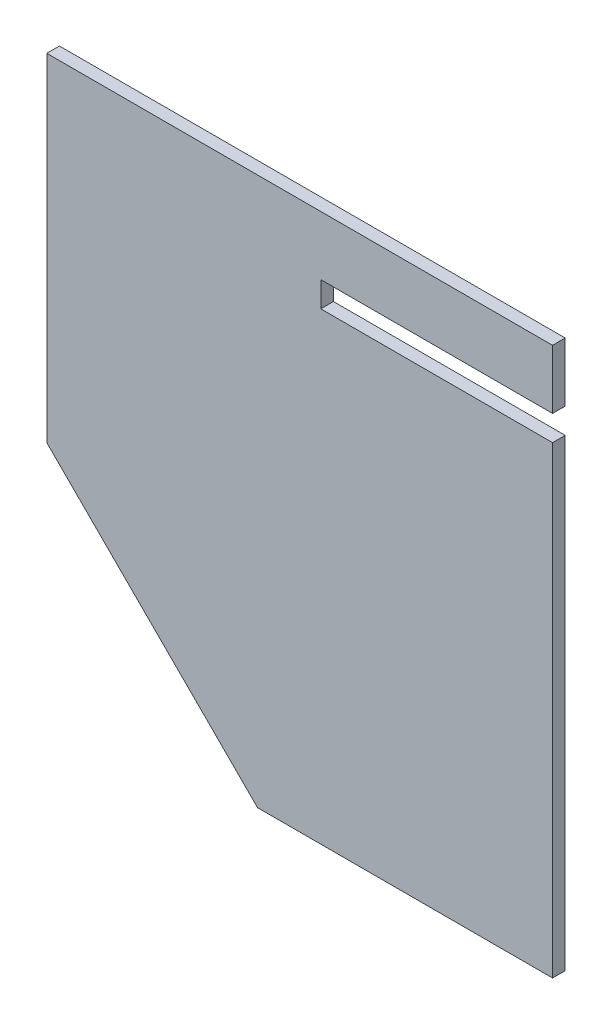
ISO-10303-21;
HEADER;
FILE_DESCRIPTION(('STEP AP214'),'2;1');
FILE_NAME('part.step','',(''),(''),'','','');
FILE_SCHEMA(('AUTOMOTIVE_DESIGN { 1 0 10303 214 1 1 1 1 }'));
ENDSEC;
DATA;
#1=APPLICATION_CONTEXT('core data for automotive mechanical design processes');
#2=APPLICATION_PROTOCOL_DEFINITION('international standard','automotive_design',2000,#1);
#3=PRODUCT_CONTEXT('',#1,'mechanical');
#4=PRODUCT('Part','Part','',(#3));
#5=PRODUCT_RELATED_PRODUCT_CATEGORY('part','',(#4));
#6=PRODUCT_DEFINITION_FORMATION('','',#4);
#7=PRODUCT_DEFINITION_CONTEXT('part definition',#1,'design');
#8=PRODUCT_DEFINITION('design','',#6,#7);
#9=PRODUCT_DEFINITION_SHAPE('','',#8);
#10=(LENGTH_UNIT() NAMED_UNIT(*) SI_UNIT(.MILLI.,.METRE.));
#11=(NAMED_UNIT(*) PLANE_ANGLE_UNIT() SI_UNIT($,.RADIAN.));
#12=(NAMED_UNIT(*) SI_UNIT($,.STERADIAN.) SOLID_ANGLE_UNIT());
#13=UNCERTAINTY_MEASURE_WITH_UNIT(LENGTH_MEASURE(1.E-05),#10,'distance_accuracy_value','');
#14=(GEOMETRIC_REPRESENTATION_CONTEXT(3) GLOBAL_UNCERTAINTY_ASSIGNED_CONTEXT((#13)) GLOBAL_UNIT_ASSIGNED_CONTEXT((#10,
#11,#12)) REPRESENTATION_CONTEXT('',''));
#15=CARTESIAN_POINT('',(0.,0.,0.));
#16=DIRECTION('',(0.,0.,1.));
#17=DIRECTION('',(1.,0.,0.));
#18=AXIS2_PLACEMENT_3D('',#15,#16,#17);
#19=CARTESIAN_POINT('',(-50.,50.,3.));
#20=DIRECTION('',(0.707106781186547,0.707106781186548,0.));
#21=DIRECTION('',(-0.707106781186548,0.707106781186547,0.));
#22=AXIS2_PLACEMENT_3D('',#19,#20,#21);
#23=PLANE('',#22);
#24=DIRECTION('',(0.707106781186548,-0.707106781186547,0.));
#25=VECTOR('',#24,1.);
#26=CARTESIAN_POINT('',(-50.,50.,0.));
#27=LINE('',#26,#25);
#28=CARTESIAN_POINT('',(-50.,50.,0.));
#29=VERTEX_POINT('',#28);
#30=CARTESIAN_POINT('',(0.,0.,0.));
#31=VERTEX_POINT('',#30);
#32=EDGE_CURVE('E146',#29,#31,#27,.T.);
#33=ORIENTED_EDGE('',*,*,#32,.T.);
#34=DIRECTION('',(0.,0.,-1.));
#35=VECTOR('',#34,1.);
#36=CARTESIAN_POINT('',(0.,0.,3.));
#37=LINE('',#36,#35);
#38=CARTESIAN_POINT('',(0.,0.,3.));
#39=VERTEX_POINT('',#38);
#40=EDGE_CURVE('E11',#39,#31,#37,.T.);
#41=ORIENTED_EDGE('',*,*,#40,.F.);
#42=DIRECTION('',(0.707106781186548,-0.707106781186547,0.));
#43=VECTOR('',#42,1.);
#44=CARTESIAN_POINT('',(-50.,50.,3.));
#45=LINE('',#44,#43);
#46=CARTESIAN_POINT('',(-50.,50.,3.));
#47=VERTEX_POINT('',#46);
#48=EDGE_CURVE('E171',#47,#39,#45,.T.);
#49=ORIENTED_EDGE('',*,*,#48,.F.);
#50=DIRECTION('',(0.,0.,-1.));
#51=VECTOR('',#50,1.);
#52=CARTESIAN_POINT('',(-50.,50.,3.));
#53=LINE('',#52,#51);
#54=EDGE_CURVE('E142',#47,#29,#53,.T.);
#55=ORIENTED_EDGE('',*,*,#54,.T.);
#56=EDGE_LOOP('',(#33,#41,#49,#55));
#57=FACE_BOUND('',#56,.T.);
#58=ADVANCED_FACE('F39',(#57),#23,.F.);
#59=CARTESIAN_POINT('',(0.,0.,3.));
#60=DIRECTION('',(0.,1.,0.));
#61=DIRECTION('',(0.,0.,1.));
#62=AXIS2_PLACEMENT_3D('',#59,#60,#61);
#63=PLANE('',#62);
#64=DIRECTION('',(1.,0.,0.));
#65=VECTOR('',#64,1.);
#66=CARTESIAN_POINT('',(0.,0.,0.));
#67=LINE('',#66,#65);
#68=CARTESIAN_POINT('',(70.,0.,0.));
#69=VERTEX_POINT('',#68);
#70=EDGE_CURVE('E150',#31,#69,#67,.T.);
#71=ORIENTED_EDGE('',*,*,#70,.T.);
#72=DIRECTION('',(0.,0.,-1.));
#73=VECTOR('',#72,1.);
#74=CARTESIAN_POINT('',(70.,0.,3.));
#75=LINE('',#74,#73);
#76=CARTESIAN_POINT('',(70.,0.,3.));
#77=VERTEX_POINT('',#76);
#78=EDGE_CURVE('E48',#77,#69,#75,.T.);
#79=ORIENTED_EDGE('',*,*,#78,.F.);
#80=DIRECTION('',(1.,0.,0.));
#81=VECTOR('',#80,1.);
#82=CARTESIAN_POINT('',(0.,0.,3.));
#83=LINE('',#82,#81);
#84=EDGE_CURVE('E102',#39,#77,#83,.T.);
#85=ORIENTED_EDGE('',*,*,#84,.F.);
#86=ORIENTED_EDGE('',*,*,#40,.T.);
#87=EDGE_LOOP('',(#71,#79,#85,#86));
#88=FACE_BOUND('',#87,.T.);
#89=ADVANCED_FACE('F227',(#88),#63,.F.);
#90=CARTESIAN_POINT('',(70.,0.,3.));
#91=DIRECTION('',(-1.,0.,0.));
#92=DIRECTION('',(0.,0.,1.));
#93=AXIS2_PLACEMENT_3D('',#90,#91,#92);
#94=PLANE('',#93);
#95=DIRECTION('',(0.,1.,0.));
#96=VECTOR('',#95,1.);
#97=CARTESIAN_POINT('',(70.,0.,0.));
#98=LINE('',#97,#96);
#99=CARTESIAN_POINT('',(70.,110.,0.));
#100=VERTEX_POINT('',#99);
#101=EDGE_CURVE('E153',#69,#100,#98,.T.);
#102=ORIENTED_EDGE('',*,*,#101,.T.);
#103=DIRECTION('',(0.,0.,-1.));
#104=VECTOR('',#103,1.);
#105=CARTESIAN_POINT('',(70.,110.,3.));
#106=LINE('',#105,#104);
#107=CARTESIAN_POINT('',(70.,110.,3.));
#108=VERTEX_POINT('',#107);
#109=EDGE_CURVE('E186',#108,#100,#106,.T.);
#110=ORIENTED_EDGE('',*,*,#109,.F.);
#111=DIRECTION('',(0.,1.,0.));
#112=VECTOR('',#111,1.);
#113=CARTESIAN_POINT('',(70.,0.,3.));
#114=LINE('',#113,#112);
#115=EDGE_CURVE('E196',#77,#108,#114,.T.);
#116=ORIENTED_EDGE('',*,*,#115,.F.);
#117=ORIENTED_EDGE('',*,*,#78,.T.);
#118=EDGE_LOOP('',(#102,#110,#116,#117));
#119=FACE_BOUND('',#118,.T.);
#120=ADVANCED_FACE('F194',(#119),#94,.F.);
#121=CARTESIAN_POINT('',(70.,110.,3.));
#122=DIRECTION('',(0.,-1.,0.));
#123=DIRECTION('',(1.,0.,0.));
#124=AXIS2_PLACEMENT_3D('',#121,#122,#123);
#125=PLANE('',#124);
#126=DIRECTION('',(-1.,0.,0.));
#127=VECTOR('',#126,1.);
#128=CARTESIAN_POINT('',(70.,110.,0.));
#129=LINE('',#128,#127);
#130=CARTESIAN_POINT('',(15.,110.,0.));
#131=VERTEX_POINT('',#130);
#132=EDGE_CURVE('E156',#100,#131,#129,.T.);
#133=ORIENTED_EDGE('',*,*,#132,.T.);
#134=DIRECTION('',(0.,0.,-1.));
#135=VECTOR('',#134,1.);
#136=CARTESIAN_POINT('',(15.,110.,3.));
#137=LINE('',#136,#135);
#138=CARTESIAN_POINT('',(15.,110.,3.));
#139=VERTEX_POINT('',#138);
#140=EDGE_CURVE('E182',#139,#131,#137,.T.);
#141=ORIENTED_EDGE('',*,*,#140,.F.);
#142=DIRECTION('',(-1.,0.,0.));
#143=VECTOR('',#142,1.);
#144=CARTESIAN_POINT('',(70.,110.,3.));
#145=LINE('',#144,#143);
#146=EDGE_CURVE('E213',#108,#139,#145,.T.);
#147=ORIENTED_EDGE('',*,*,#146,.F.);
#148=ORIENTED_EDGE('',*,*,#109,.T.);
#149=EDGE_LOOP('',(#133,#141,#147,#148));
#150=FACE_BOUND('',#149,.T.);
#151=ADVANCED_FACE('F205',(#150),#125,.F.);
#152=CARTESIAN_POINT('',(15.,110.,3.));
#153=DIRECTION('',(-1.,0.,0.));
#154=DIRECTION('',(0.,0.,1.));
#155=AXIS2_PLACEMENT_3D('',#152,#153,#154);
#156=PLANE('',#155);
#157=DIRECTION('',(0.,1.,0.));
#158=VECTOR('',#157,1.);
#159=CARTESIAN_POINT('',(15.,110.,0.));
#160=LINE('',#159,#158);
#161=CARTESIAN_POINT('',(15.,116.,0.));
#162=VERTEX_POINT('',#161);
#163=EDGE_CURVE('E159',#131,#162,#160,.T.);
#164=ORIENTED_EDGE('',*,*,#163,.T.);
#165=DIRECTION('',(0.,0.,-1.));
#166=VECTOR('',#165,1.);
#167=CARTESIAN_POINT('',(15.,116.,3.));
#168=LINE('',#167,#166);
#169=CARTESIAN_POINT('',(15.,116.,3.));
#170=VERTEX_POINT('',#169);
#171=EDGE_CURVE('E178',#170,#162,#168,.T.);
#172=ORIENTED_EDGE('',*,*,#171,.F.);
#173=DIRECTION('',(0.,1.,0.));
#174=VECTOR('',#173,1.);
#175=CARTESIAN_POINT('',(15.,110.,3.));
#176=LINE('',#175,#174);
#177=EDGE_CURVE('E211',#139,#170,#176,.T.);
#178=ORIENTED_EDGE('',*,*,#177,.F.);
#179=ORIENTED_EDGE('',*,*,#140,.T.);
#180=EDGE_LOOP('',(#164,#172,#178,#179));
#181=FACE_BOUND('',#180,.T.);
#182=ADVANCED_FACE('F209',(#181),#156,.F.);
#183=CARTESIAN_POINT('',(15.,116.,3.));
#184=DIRECTION('',(0.,1.,0.));
#185=DIRECTION('',(-1.,0.,0.));
#186=AXIS2_PLACEMENT_3D('',#183,#184,#185);
#187=PLANE('',#186);
#188=DIRECTION('',(1.,0.,0.));
#189=VECTOR('',#188,1.);
#190=CARTESIAN_POINT('',(15.,116.,0.));
#191=LINE('',#190,#189);
#192=CARTESIAN_POINT('',(70.,116.,0.));
#193=VERTEX_POINT('',#192);
#194=EDGE_CURVE('E162',#162,#193,#191,.T.);
#195=ORIENTED_EDGE('',*,*,#194,.T.);
#196=DIRECTION('',(0.,0.,-1.));
#197=VECTOR('',#196,1.);
#198=CARTESIAN_POINT('',(70.,116.,3.));
#199=LINE('',#198,#197);
#200=CARTESIAN_POINT('',(70.,116.,3.));
#201=VERTEX_POINT('',#200);
#202=EDGE_CURVE('E135',#201,#193,#199,.T.);
#203=ORIENTED_EDGE('',*,*,#202,.F.);
#204=DIRECTION('',(1.,0.,0.));
#205=VECTOR('',#204,1.);
#206=CARTESIAN_POINT('',(15.,116.,3.));
#207=LINE('',#206,#205);
#208=EDGE_CURVE('E124',#170,#201,#207,.T.);
#209=ORIENTED_EDGE('',*,*,#208,.F.);
#210=ORIENTED_EDGE('',*,*,#171,.T.);
#211=EDGE_LOOP('',(#195,#203,#209,#210));
#212=FACE_BOUND('',#211,.T.);
#213=ADVANCED_FACE('F239',(#212),#187,.F.);
#214=CARTESIAN_POINT('',(70.,116.,3.));
#215=DIRECTION('',(-1.,0.,0.));
#216=DIRECTION('',(0.,-1.,0.));
#217=AXIS2_PLACEMENT_3D('',#214,#215,#216);
#218=PLANE('',#217);
#219=DIRECTION('',(0.,1.,0.));
#220=VECTOR('',#219,1.);
#221=CARTESIAN_POINT('',(70.,116.,0.));
#222=LINE('',#221,#220);
#223=CARTESIAN_POINT('',(70.,130.,0.));
#224=VERTEX_POINT('',#223);
#225=EDGE_CURVE('E133',#193,#224,#222,.T.);
#226=ORIENTED_EDGE('',*,*,#225,.T.);
#227=DIRECTION('',(0.,0.,-1.));
#228=VECTOR('',#227,1.);
#229=CARTESIAN_POINT('',(70.,130.,3.));
#230=LINE('',#229,#228);
#231=CARTESIAN_POINT('',(70.,130.,3.));
#232=VERTEX_POINT('',#231);
#233=EDGE_CURVE('E130',#232,#224,#230,.T.);
#234=ORIENTED_EDGE('',*,*,#233,.F.);
#235=DIRECTION('',(0.,1.,0.));
#236=VECTOR('',#235,1.);
#237=CARTESIAN_POINT('',(70.,116.,3.));
#238=LINE('',#237,#236);
#239=EDGE_CURVE('E118',#201,#232,#238,.T.);
#240=ORIENTED_EDGE('',*,*,#239,.F.);
#241=ORIENTED_EDGE('',*,*,#202,.T.);
#242=EDGE_LOOP('',(#226,#234,#240,#241));
#243=FACE_BOUND('',#242,.T.);
#244=ADVANCED_FACE('F131',(#243),#218,.F.);
#245=CARTESIAN_POINT('',(70.,130.,3.));
#246=DIRECTION('',(0.,-1.,0.));
#247=DIRECTION('',(1.,0.,0.));
#248=AXIS2_PLACEMENT_3D('',#245,#246,#247);
#249=PLANE('',#248);
#250=DIRECTION('',(-1.,0.,0.));
#251=VECTOR('',#250,1.);
#252=CARTESIAN_POINT('',(70.,130.,0.));
#253=LINE('',#252,#251);
#254=CARTESIAN_POINT('',(-50.,130.,0.));
#255=VERTEX_POINT('',#254);
#256=EDGE_CURVE('E88',#224,#255,#253,.T.);
#257=ORIENTED_EDGE('',*,*,#256,.T.);
#258=DIRECTION('',(0.,0.,-1.));
#259=VECTOR('',#258,1.);
#260=CARTESIAN_POINT('',(-50.,130.,3.));
#261=LINE('',#260,#259);
#262=CARTESIAN_POINT('',(-50.,130.,3.));
#263=VERTEX_POINT('',#262);
#264=EDGE_CURVE('E136',#263,#255,#261,.T.);
#265=ORIENTED_EDGE('',*,*,#264,.F.);
#266=DIRECTION('',(-1.,0.,0.));
#267=VECTOR('',#266,1.);
#268=CARTESIAN_POINT('',(70.,130.,3.));
#269=LINE('',#268,#267);
#270=EDGE_CURVE('E122',#232,#263,#269,.T.);
#271=ORIENTED_EDGE('',*,*,#270,.F.);
#272=ORIENTED_EDGE('',*,*,#233,.T.);
#273=EDGE_LOOP('',(#257,#265,#271,#272));
#274=FACE_BOUND('',#273,.T.);
#275=ADVANCED_FACE('F138',(#274),#249,.F.);
#276=CARTESIAN_POINT('',(-50.,130.,3.));
#277=DIRECTION('',(1.,0.,0.));
#278=DIRECTION('',(0.,1.,0.));
#279=AXIS2_PLACEMENT_3D('',#276,#277,#278);
#280=PLANE('',#279);
#281=DIRECTION('',(0.,-1.,0.));
#282=VECTOR('',#281,1.);
#283=CARTESIAN_POINT('',(-50.,130.,0.));
#284=LINE('',#283,#282);
#285=EDGE_CURVE('E94',#255,#29,#284,.T.);
#286=ORIENTED_EDGE('',*,*,#285,.T.);
#287=ORIENTED_EDGE('',*,*,#54,.F.);
#288=DIRECTION('',(0.,-1.,0.));
#289=VECTOR('',#288,1.);
#290=CARTESIAN_POINT('',(-50.,130.,3.));
#291=LINE('',#290,#289);
#292=EDGE_CURVE('E56',#263,#47,#291,.T.);
#293=ORIENTED_EDGE('',*,*,#292,.F.);
#294=ORIENTED_EDGE('',*,*,#264,.T.);
#295=EDGE_LOOP('',(#286,#287,#293,#294));
#296=FACE_BOUND('',#295,.T.);
#297=ADVANCED_FACE('F247',(#296),#280,.F.);
#298=CARTESIAN_POINT('',(0.,0.,3.));
#299=DIRECTION('',(0.,0.,1.));
#300=DIRECTION('',(1.,0.,0.));
#301=AXIS2_PLACEMENT_3D('',#298,#299,#300);
#302=PLANE('',#301);
#303=ORIENTED_EDGE('',*,*,#48,.T.);
#304=ORIENTED_EDGE('',*,*,#84,.T.);
#305=ORIENTED_EDGE('',*,*,#115,.T.);
#306=ORIENTED_EDGE('',*,*,#146,.T.);
#307=ORIENTED_EDGE('',*,*,#177,.T.);
#308=ORIENTED_EDGE('',*,*,#208,.T.);
#309=ORIENTED_EDGE('',*,*,#239,.T.);
#310=ORIENTED_EDGE('',*,*,#270,.T.);
#311=ORIENTED_EDGE('',*,*,#292,.T.);
#312=EDGE_LOOP('',(#303,#304,#305,#306,#307,#308,#309,#310,#311));
#313=FACE_BOUND('',#312,.T.);
#314=ADVANCED_FACE('F120',(#313),#302,.T.);
#315=CARTESIAN_POINT('',(0.,0.,0.));
#316=DIRECTION('',(0.,0.,1.));
#317=DIRECTION('',(1.,0.,0.));
#318=AXIS2_PLACEMENT_3D('',#315,#316,#317);
#319=PLANE('',#318);
#320=ORIENTED_EDGE('',*,*,#32,.F.);
#321=ORIENTED_EDGE('',*,*,#285,.F.);
#322=ORIENTED_EDGE('',*,*,#256,.F.);
#323=ORIENTED_EDGE('',*,*,#225,.F.);
#324=ORIENTED_EDGE('',*,*,#194,.F.);
#325=ORIENTED_EDGE('',*,*,#163,.F.);
#326=ORIENTED_EDGE('',*,*,#132,.F.);
#327=ORIENTED_EDGE('',*,*,#101,.F.);
#328=ORIENTED_EDGE('',*,*,#70,.F.);
#329=EDGE_LOOP('',(#320,#321,#322,#323,#324,#325,#326,#327,#328));
#330=FACE_BOUND('',#329,.T.);
#331=ADVANCED_FACE('F200',(#330),#319,.F.);
#332=CLOSED_SHELL('',(#58,#89,#120,#151,#182,#213,#244,#275,#297,#314,#331));
#333=MANIFOLD_SOLID_BREP('B2',#332);
#334=ADVANCED_BREP_SHAPE_REPRESENTATION('',(#18,#333),#14);
#335=SHAPE_DEFINITION_REPRESENTATION(#9,#334);
ENDSEC;
END-ISO-10303-21;
